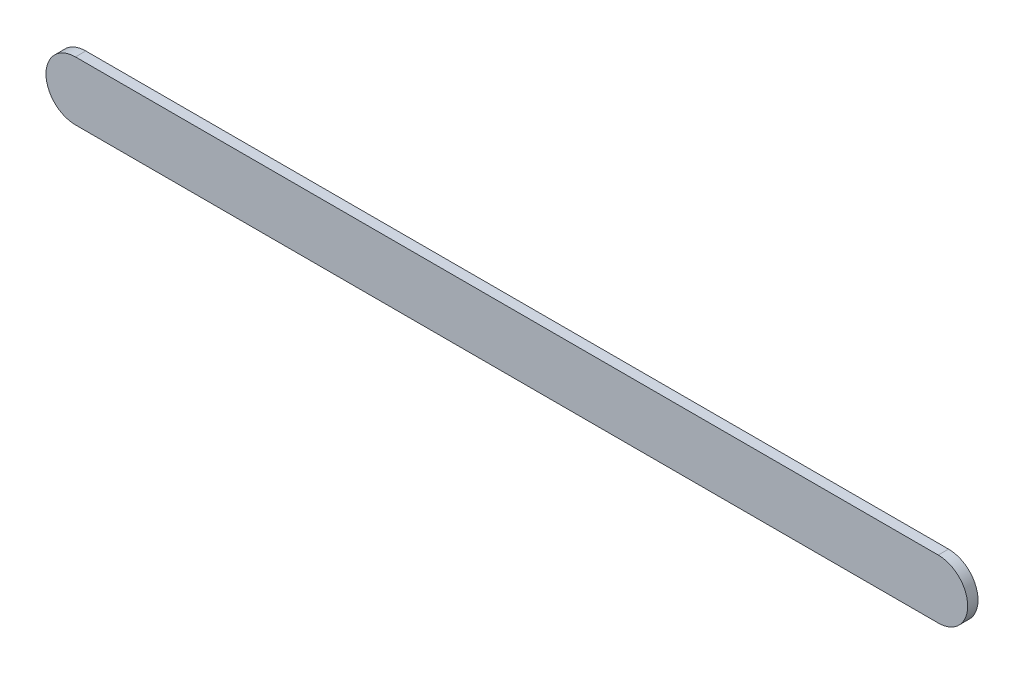
ISO-10303-21;
HEADER;
FILE_DESCRIPTION(('STEP AP214'),'2;1');
FILE_NAME('part.step','',(''),(''),'','','');
FILE_SCHEMA(('AUTOMOTIVE_DESIGN { 1 0 10303 214 1 1 1 1 }'));
ENDSEC;
DATA;
#1=APPLICATION_CONTEXT('core data for automotive mechanical design processes');
#2=APPLICATION_PROTOCOL_DEFINITION('international standard','automotive_design',2000,#1);
#3=PRODUCT_CONTEXT('',#1,'mechanical');
#4=PRODUCT('Part','Part','',(#3));
#5=PRODUCT_RELATED_PRODUCT_CATEGORY('part','',(#4));
#6=PRODUCT_DEFINITION_FORMATION('','',#4);
#7=PRODUCT_DEFINITION_CONTEXT('part definition',#1,'design');
#8=PRODUCT_DEFINITION('design','',#6,#7);
#9=PRODUCT_DEFINITION_SHAPE('','',#8);
#10=(LENGTH_UNIT() NAMED_UNIT(*) SI_UNIT(.MILLI.,.METRE.));
#11=(NAMED_UNIT(*) PLANE_ANGLE_UNIT() SI_UNIT($,.RADIAN.));
#12=(NAMED_UNIT(*) SI_UNIT($,.STERADIAN.) SOLID_ANGLE_UNIT());
#13=UNCERTAINTY_MEASURE_WITH_UNIT(LENGTH_MEASURE(1.E-05),#10,'distance_accuracy_value','');
#14=(GEOMETRIC_REPRESENTATION_CONTEXT(3) GLOBAL_UNCERTAINTY_ASSIGNED_CONTEXT((#13)) GLOBAL_UNIT_ASSIGNED_CONTEXT((#10,
#11,#12)) REPRESENTATION_CONTEXT('',''));
#15=CARTESIAN_POINT('',(0.,0.,0.));
#16=DIRECTION('',(0.,0.,1.));
#17=DIRECTION('',(1.,0.,0.));
#18=AXIS2_PLACEMENT_3D('',#15,#16,#17);
#19=CARTESIAN_POINT('',(85.81,-129.1,1.635));
#20=DIRECTION('',(0.,0.,1.));
#21=DIRECTION('',(1.,0.,0.));
#22=AXIS2_PLACEMENT_3D('',#19,#20,#21);
#23=PLANE('',#22);
#24=DIRECTION('',(1.,0.,0.));
#25=VECTOR('',#24,1.);
#26=CARTESIAN_POINT('',(85.81,-129.1,1.635));
#27=LINE('',#26,#25);
#28=CARTESIAN_POINT('',(85.81,-129.1,1.635));
#29=VERTEX_POINT('',#28);
#30=CARTESIAN_POINT('',(88.73934,-129.1,1.635));
#31=VERTEX_POINT('',#30);
#32=EDGE_CURVE('E82',#29,#31,#27,.T.);
#33=ORIENTED_EDGE('',*,*,#32,.T.);
#34=CARTESIAN_POINT('',(88.73934,-129.,1.635));
#35=DIRECTION('',(0.,0.,1.));
#36=DIRECTION('',(0.,-1.,0.));
#37=AXIS2_PLACEMENT_3D('',#34,#35,#36);
#38=CIRCLE('',#37,0.1);
#39=CARTESIAN_POINT('',(88.73934,-128.9,1.635));
#40=VERTEX_POINT('',#39);
#41=EDGE_CURVE('E105',#31,#40,#38,.T.);
#42=ORIENTED_EDGE('',*,*,#41,.T.);
#43=DIRECTION('',(-1.,0.,0.));
#44=VECTOR('',#43,1.);
#45=CARTESIAN_POINT('',(88.73934,-128.9,1.635));
#46=LINE('',#45,#44);
#47=CARTESIAN_POINT('',(85.81,-128.9,1.635));
#48=VERTEX_POINT('',#47);
#49=EDGE_CURVE('E75',#40,#48,#46,.T.);
#50=ORIENTED_EDGE('',*,*,#49,.T.);
#51=CARTESIAN_POINT('',(85.81,-129.,1.635));
#52=DIRECTION('',(0.,0.,1.));
#53=DIRECTION('',(0.,1.,0.));
#54=AXIS2_PLACEMENT_3D('',#51,#52,#53);
#55=CIRCLE('',#54,0.1);
#56=EDGE_CURVE('E11',#48,#29,#55,.T.);
#57=ORIENTED_EDGE('',*,*,#56,.T.);
#58=EDGE_LOOP('',(#33,#42,#50,#57));
#59=FACE_BOUND('',#58,.T.);
#60=ADVANCED_FACE('F17',(#59),#23,.T.);
#61=CARTESIAN_POINT('',(85.81,-129.1,1.6));
#62=DIRECTION('',(0.,0.,1.));
#63=DIRECTION('',(1.,0.,0.));
#64=AXIS2_PLACEMENT_3D('',#61,#62,#63);
#65=PLANE('',#64);
#66=CARTESIAN_POINT('',(85.81,-129.,1.6));
#67=DIRECTION('',(0.,0.,1.));
#68=DIRECTION('',(0.,1.,0.));
#69=AXIS2_PLACEMENT_3D('',#66,#67,#68);
#70=CIRCLE('',#69,0.1);
#71=CARTESIAN_POINT('',(85.81,-128.9,1.6));
#72=VERTEX_POINT('',#71);
#73=CARTESIAN_POINT('',(85.81,-129.1,1.6));
#74=VERTEX_POINT('',#73);
#75=EDGE_CURVE('E20',#72,#74,#70,.T.);
#76=ORIENTED_EDGE('',*,*,#75,.F.);
#77=DIRECTION('',(-1.,0.,0.));
#78=VECTOR('',#77,1.);
#79=CARTESIAN_POINT('',(88.73934,-128.9,1.6));
#80=LINE('',#79,#78);
#81=CARTESIAN_POINT('',(88.73934,-128.9,1.6));
#82=VERTEX_POINT('',#81);
#83=EDGE_CURVE('E110',#82,#72,#80,.T.);
#84=ORIENTED_EDGE('',*,*,#83,.F.);
#85=CARTESIAN_POINT('',(88.73934,-129.,1.6));
#86=DIRECTION('',(0.,0.,1.));
#87=DIRECTION('',(0.,-1.,0.));
#88=AXIS2_PLACEMENT_3D('',#85,#86,#87);
#89=CIRCLE('',#88,0.1);
#90=CARTESIAN_POINT('',(88.73934,-129.1,1.6));
#91=VERTEX_POINT('',#90);
#92=EDGE_CURVE('E84',#91,#82,#89,.T.);
#93=ORIENTED_EDGE('',*,*,#92,.F.);
#94=DIRECTION('',(1.,0.,0.));
#95=VECTOR('',#94,1.);
#96=CARTESIAN_POINT('',(85.81,-129.1,1.6));
#97=LINE('',#96,#95);
#98=EDGE_CURVE('E80',#74,#91,#97,.T.);
#99=ORIENTED_EDGE('',*,*,#98,.F.);
#100=EDGE_LOOP('',(#76,#84,#93,#99));
#101=FACE_BOUND('',#100,.T.);
#102=ADVANCED_FACE('F86',(#101),#65,.F.);
#103=CARTESIAN_POINT('',(85.81,-129.,1.6));
#104=DIRECTION('',(0.,0.,-1.));
#105=DIRECTION('',(0.,1.,0.));
#106=AXIS2_PLACEMENT_3D('',#103,#104,#105);
#107=CYLINDRICAL_SURFACE('',#106,0.1);
#108=ORIENTED_EDGE('',*,*,#75,.T.);
#109=DIRECTION('',(0.,0.,1.));
#110=VECTOR('',#109,1.);
#111=CARTESIAN_POINT('',(85.81,-129.1,1.6));
#112=LINE('',#111,#110);
#113=EDGE_CURVE('E69',#74,#29,#112,.T.);
#114=ORIENTED_EDGE('',*,*,#113,.T.);
#115=ORIENTED_EDGE('',*,*,#56,.F.);
#116=DIRECTION('',(0.,0.,1.));
#117=VECTOR('',#116,1.);
#118=CARTESIAN_POINT('',(85.81,-128.9,1.6));
#119=LINE('',#118,#117);
#120=EDGE_CURVE('E72',#72,#48,#119,.T.);
#121=ORIENTED_EDGE('',*,*,#120,.F.);
#122=EDGE_LOOP('',(#108,#114,#115,#121));
#123=FACE_BOUND('',#122,.T.);
#124=ADVANCED_FACE('F68',(#123),#107,.T.);
#125=CARTESIAN_POINT('',(88.73934,-128.9,1.6));
#126=DIRECTION('',(0.,-1.,0.));
#127=DIRECTION('',(0.,0.,-1.));
#128=AXIS2_PLACEMENT_3D('',#125,#126,#127);
#129=PLANE('',#128);
#130=ORIENTED_EDGE('',*,*,#83,.T.);
#131=ORIENTED_EDGE('',*,*,#120,.T.);
#132=ORIENTED_EDGE('',*,*,#49,.F.);
#133=DIRECTION('',(0.,0.,1.));
#134=VECTOR('',#133,1.);
#135=CARTESIAN_POINT('',(88.73934,-128.9,1.6));
#136=LINE('',#135,#134);
#137=EDGE_CURVE('E100',#82,#40,#136,.T.);
#138=ORIENTED_EDGE('',*,*,#137,.F.);
#139=EDGE_LOOP('',(#130,#131,#132,#138));
#140=FACE_BOUND('',#139,.T.);
#141=ADVANCED_FACE('F120',(#140),#129,.F.);
#142=CARTESIAN_POINT('',(88.73934,-129.,1.6));
#143=DIRECTION('',(0.,0.,-1.));
#144=DIRECTION('',(0.,-1.,0.));
#145=AXIS2_PLACEMENT_3D('',#142,#143,#144);
#146=CYLINDRICAL_SURFACE('',#145,0.1);
#147=ORIENTED_EDGE('',*,*,#92,.T.);
#148=ORIENTED_EDGE('',*,*,#137,.T.);
#149=ORIENTED_EDGE('',*,*,#41,.F.);
#150=DIRECTION('',(0.,0.,1.));
#151=VECTOR('',#150,1.);
#152=CARTESIAN_POINT('',(88.73934,-129.1,1.6));
#153=LINE('',#152,#151);
#154=EDGE_CURVE('E90',#91,#31,#153,.T.);
#155=ORIENTED_EDGE('',*,*,#154,.F.);
#156=EDGE_LOOP('',(#147,#148,#149,#155));
#157=FACE_BOUND('',#156,.T.);
#158=ADVANCED_FACE('F122',(#157),#146,.T.);
#159=CARTESIAN_POINT('',(85.81,-129.1,1.6));
#160=DIRECTION('',(0.,1.,0.));
#161=DIRECTION('',(1.,0.,0.));
#162=AXIS2_PLACEMENT_3D('',#159,#160,#161);
#163=PLANE('',#162);
#164=ORIENTED_EDGE('',*,*,#98,.T.);
#165=ORIENTED_EDGE('',*,*,#154,.T.);
#166=ORIENTED_EDGE('',*,*,#32,.F.);
#167=ORIENTED_EDGE('',*,*,#113,.F.);
#168=EDGE_LOOP('',(#164,#165,#166,#167));
#169=FACE_BOUND('',#168,.T.);
#170=ADVANCED_FACE('F78',(#169),#163,.F.);
#171=CLOSED_SHELL('',(#60,#102,#124,#141,#158,#170));
#172=MANIFOLD_SOLID_BREP('B1',#171);
#173=ADVANCED_BREP_SHAPE_REPRESENTATION('',(#18,#172),#14);
#174=SHAPE_DEFINITION_REPRESENTATION(#9,#173);
ENDSEC;
END-ISO-10303-21;
